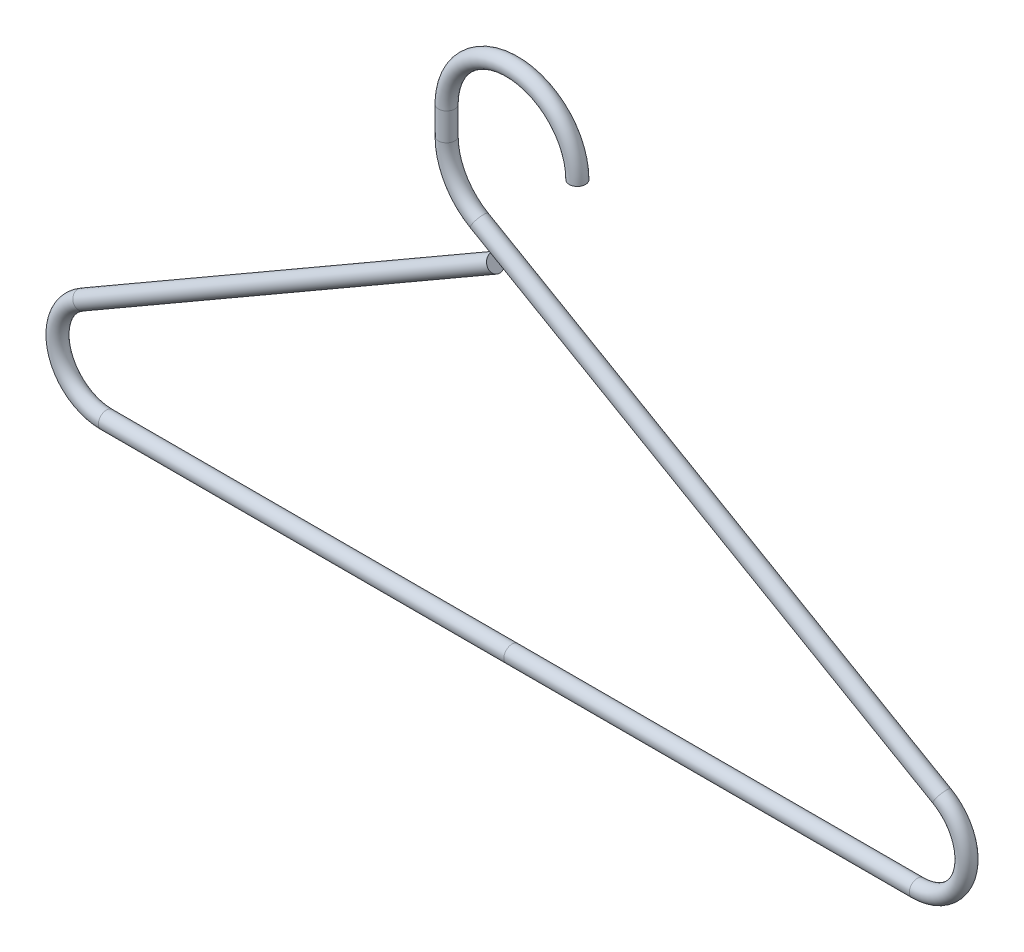
ISO-10303-21;
HEADER;
FILE_DESCRIPTION(('STEP AP214'),'2;1');
FILE_NAME('part.step','',(''),(''),'','','');
FILE_SCHEMA(('AUTOMOTIVE_DESIGN { 1 0 10303 214 1 1 1 1 }'));
ENDSEC;
DATA;
#1=APPLICATION_CONTEXT('core data for automotive mechanical design processes');
#2=APPLICATION_PROTOCOL_DEFINITION('international standard','automotive_design',2000,#1);
#3=PRODUCT_CONTEXT('',#1,'mechanical');
#4=PRODUCT('Part','Part','',(#3));
#5=PRODUCT_RELATED_PRODUCT_CATEGORY('part','',(#4));
#6=PRODUCT_DEFINITION_FORMATION('','',#4);
#7=PRODUCT_DEFINITION_CONTEXT('part definition',#1,'design');
#8=PRODUCT_DEFINITION('design','',#6,#7);
#9=PRODUCT_DEFINITION_SHAPE('','',#8);
#10=(LENGTH_UNIT() NAMED_UNIT(*) SI_UNIT(.MILLI.,.METRE.));
#11=(NAMED_UNIT(*) PLANE_ANGLE_UNIT() SI_UNIT($,.RADIAN.));
#12=(NAMED_UNIT(*) SI_UNIT($,.STERADIAN.) SOLID_ANGLE_UNIT());
#13=UNCERTAINTY_MEASURE_WITH_UNIT(LENGTH_MEASURE(1.E-05),#10,'distance_accuracy_value','');
#14=(GEOMETRIC_REPRESENTATION_CONTEXT(3) GLOBAL_UNCERTAINTY_ASSIGNED_CONTEXT((#13)) GLOBAL_UNIT_ASSIGNED_CONTEXT((#10,
#11,#12)) REPRESENTATION_CONTEXT('',''));
#15=CARTESIAN_POINT('',(0.,0.,0.));
#16=DIRECTION('',(0.,0.,1.));
#17=DIRECTION('',(1.,0.,0.));
#18=AXIS2_PLACEMENT_3D('',#15,#16,#17);
#19=CARTESIAN_POINT('',(25.4000000000011,172.046968374161,0.));
#20=DIRECTION('',(0.,-1.,0.));
#21=DIRECTION('',(1.,0.,0.));
#22=AXIS2_PLACEMENT_3D('',#19,#20,#21);
#23=PLANE('',#22);
#24=CARTESIAN_POINT('',(25.4000000000011,172.046968374161,0.));
#25=DIRECTION('',(0.,-1.,0.));
#26=DIRECTION('',(1.,0.,0.));
#27=AXIS2_PLACEMENT_3D('',#24,#25,#26);
#28=CIRCLE('',#27,3.175);
#29=CARTESIAN_POINT('',(28.5750000000011,172.046968374161,0.));
#30=VERTEX_POINT('',#29);
#31=EDGE_CURVE('E57',#30,#30,#28,.T.);
#32=ORIENTED_EDGE('',*,*,#31,.T.);
#33=EDGE_LOOP('',(#32));
#34=FACE_BOUND('',#33,.T.);
#35=ADVANCED_FACE('F45',(#34),#23,.T.);
#36=CARTESIAN_POINT('',(-6.35000000000019,128.316097327393,0.));
#37=DIRECTION('',(-0.866025403784441,-0.499999999999995,0.));
#38=DIRECTION('',(0.499999999999995,-0.866025403784442,0.));
#39=AXIS2_PLACEMENT_3D('',#36,#37,#38);
#40=PLANE('',#39);
#41=CARTESIAN_POINT('',(-6.35000000000019,128.316097327393,0.));
#42=DIRECTION('',(-0.866025403784441,-0.499999999999995,0.));
#43=DIRECTION('',(0.499999999999995,-0.866025403784442,0.));
#44=AXIS2_PLACEMENT_3D('',#41,#42,#43);
#45=CIRCLE('',#44,3.175);
#46=CARTESIAN_POINT('',(-4.7625000000002,125.566466670377,0.));
#47=VERTEX_POINT('',#46);
#48=EDGE_CURVE('E12',#47,#47,#45,.T.);
#49=ORIENTED_EDGE('',*,*,#48,.F.);
#50=EDGE_LOOP('',(#49));
#51=FACE_BOUND('',#50,.T.);
#52=ADVANCED_FACE('F63',(#51),#40,.F.);
#53=CARTESIAN_POINT('',(1.0998146837693E-12,172.046968374161,0.));
#54=DIRECTION('',(0.,0.,1.));
#55=DIRECTION('',(1.,0.,0.));
#56=AXIS2_PLACEMENT_3D('',#53,#54,#55);
#57=TOROIDAL_SURFACE('',#56,25.4,3.175);
#58=CARTESIAN_POINT('',(-25.3999999999989,172.046968374162,0.));
#59=DIRECTION('',(0.,1.,0.));
#60=DIRECTION('',(-1.,0.,0.));
#61=AXIS2_PLACEMENT_3D('',#58,#59,#60);
#62=CIRCLE('',#61,3.175);
#63=CARTESIAN_POINT('',(-28.5749999999989,172.046968374162,0.));
#64=VERTEX_POINT('',#63);
#65=EDGE_CURVE('E113',#64,#64,#62,.T.);
#66=ORIENTED_EDGE('',*,*,#65,.T.);
#67=EDGE_LOOP('',(#66));
#68=FACE_BOUND('',#67,.T.);
#69=ORIENTED_EDGE('',*,*,#31,.F.);
#70=EDGE_LOOP('',(#69));
#71=FACE_BOUND('',#70,.T.);
#72=ADVANCED_FACE('F65',(#68,#71),#57,.T.);
#73=CARTESIAN_POINT('',(-25.3999999999989,172.046968374162,0.));
#74=DIRECTION('',(0.,-1.,0.));
#75=DIRECTION('',(0.,0.,-1.));
#76=AXIS2_PLACEMENT_3D('',#73,#74,#75);
#77=CYLINDRICAL_SURFACE('',#76,3.175);
#78=CARTESIAN_POINT('',(-25.3999999999989,161.311665211579,0.));
#79=DIRECTION('',(0.,1.,0.));
#80=DIRECTION('',(-1.,0.,0.));
#81=AXIS2_PLACEMENT_3D('',#78,#79,#80);
#82=CIRCLE('',#81,3.175);
#83=CARTESIAN_POINT('',(-28.5749999999987,161.311665211579,0.));
#84=VERTEX_POINT('',#83);
#85=EDGE_CURVE('E110',#84,#84,#82,.T.);
#86=ORIENTED_EDGE('',*,*,#85,.T.);
#87=EDGE_LOOP('',(#86));
#88=FACE_BOUND('',#87,.T.);
#89=ORIENTED_EDGE('',*,*,#65,.F.);
#90=EDGE_LOOP('',(#89));
#91=FACE_BOUND('',#90,.T.);
#92=ADVANCED_FACE('F70',(#88,#91),#77,.T.);
#93=CARTESIAN_POINT('',(1.32185928869433E-12,161.311665211579,0.));
#94=DIRECTION('',(0.,0.,1.));
#95=DIRECTION('',(1.,0.,0.));
#96=AXIS2_PLACEMENT_3D('',#93,#94,#95);
#97=TOROIDAL_SURFACE('',#96,25.4000000000001,3.175);
#98=CARTESIAN_POINT('',(-12.6999999999988,139.314619955454,0.));
#99=DIRECTION('',(-0.866025403784436,0.500000000000004,0.));
#100=DIRECTION('',(-0.500000000000004,-0.866025403784436,0.));
#101=AXIS2_PLACEMENT_3D('',#98,#99,#100);
#102=CIRCLE('',#101,3.175);
#103=CARTESIAN_POINT('',(-14.2874999999988,136.564989298438,0.));
#104=VERTEX_POINT('',#103);
#105=EDGE_CURVE('E115',#104,#104,#102,.T.);
#106=CARTESIAN_POINT('',(1.32185928869433E-12,161.311665211579,0.));
#107=DIRECTION('',(0.,0.,1.));
#108=DIRECTION('',(1.,0.,0.));
#109=AXIS2_PLACEMENT_3D('',#106,#107,#108);
#110=CIRCLE('',#109,28.5750000000001);
#111=EDGE_CURVE('',#84,#104,#110,.T.);
#112=ORIENTED_EDGE('',*,*,#85,.F.);
#113=ORIENTED_EDGE('',*,*,#105,.T.);
#114=ORIENTED_EDGE('',*,*,#111,.T.);
#115=ORIENTED_EDGE('',*,*,#111,.F.);
#116=EDGE_LOOP('',(#112,#114,#113,#115));
#117=FACE_BOUND('',#116,.T.);
#118=ADVANCED_FACE('F98',(#117),#97,.T.);
#119=CARTESIAN_POINT('',(-12.6999999999988,139.314619955454,0.));
#120=DIRECTION('',(0.866025403784442,-0.499999999999995,0.));
#121=DIRECTION('',(0.499999999999995,0.866025403784442,0.));
#122=AXIS2_PLACEMENT_3D('',#119,#120,#121);
#123=CYLINDRICAL_SURFACE('',#122,3.175);
#124=CARTESIAN_POINT('',(167.029432115812,35.5477839420936,0.));
#125=DIRECTION('',(-0.866025403784442,0.499999999999995,0.));
#126=DIRECTION('',(-0.499999999999995,-0.866025403784442,0.));
#127=AXIS2_PLACEMENT_3D('',#124,#125,#126);
#128=CIRCLE('',#127,3.175);
#129=CARTESIAN_POINT('',(168.616932115812,38.2974145991092,0.));
#130=VERTEX_POINT('',#129);
#131=EDGE_CURVE('E121',#130,#130,#128,.T.);
#132=ORIENTED_EDGE('',*,*,#131,.T.);
#133=EDGE_LOOP('',(#132));
#134=FACE_BOUND('',#133,.T.);
#135=ORIENTED_EDGE('',*,*,#105,.F.);
#136=EDGE_LOOP('',(#135));
#137=FACE_BOUND('',#136,.T.);
#138=ADVANCED_FACE('F94',(#134,#137),#123,.T.);
#139=CARTESIAN_POINT('',(157.504432115812,19.05,0.));
#140=DIRECTION('',(0.,0.,-1.));
#141=DIRECTION('',(-1.,0.,0.));
#142=AXIS2_PLACEMENT_3D('',#139,#140,#141);
#143=TOROIDAL_SURFACE('',#142,19.05,3.175);
#144=CARTESIAN_POINT('',(157.504432115812,0.,0.));
#145=DIRECTION('',(1.,0.,0.));
#146=DIRECTION('',(0.,1.,0.));
#147=AXIS2_PLACEMENT_3D('',#144,#145,#146);
#148=CIRCLE('',#147,3.175);
#149=CARTESIAN_POINT('',(157.504432115812,-3.175,0.));
#150=VERTEX_POINT('',#149);
#151=EDGE_CURVE('E124',#150,#150,#148,.T.);
#152=CARTESIAN_POINT('',(157.504432115812,19.05,0.));
#153=DIRECTION('',(0.,0.,-1.));
#154=DIRECTION('',(-1.,0.,0.));
#155=AXIS2_PLACEMENT_3D('',#152,#153,#154);
#156=CIRCLE('',#155,22.225);
#157=EDGE_CURVE('',#130,#150,#156,.T.);
#158=ORIENTED_EDGE('',*,*,#131,.F.);
#159=ORIENTED_EDGE('',*,*,#151,.T.);
#160=ORIENTED_EDGE('',*,*,#157,.T.);
#161=ORIENTED_EDGE('',*,*,#157,.F.);
#162=EDGE_LOOP('',(#158,#160,#159,#161));
#163=FACE_BOUND('',#162,.T.);
#164=ADVANCED_FACE('F90',(#163),#143,.T.);
#165=CARTESIAN_POINT('',(157.504432115812,0.,0.));
#166=DIRECTION('',(-1.,0.,0.));
#167=DIRECTION('',(0.,0.,1.));
#168=AXIS2_PLACEMENT_3D('',#165,#166,#167);
#169=CYLINDRICAL_SURFACE('',#168,3.175);
#170=CARTESIAN_POINT('',(0.,0.,0.));
#171=DIRECTION('',(1.,0.,0.));
#172=DIRECTION('',(0.,1.,0.));
#173=AXIS2_PLACEMENT_3D('',#170,#171,#172);
#174=CIRCLE('',#173,3.175);
#175=CARTESIAN_POINT('',(0.,3.17499999999999,0.));
#176=VERTEX_POINT('',#175);
#177=EDGE_CURVE('E127',#176,#176,#174,.T.);
#178=ORIENTED_EDGE('',*,*,#177,.T.);
#179=EDGE_LOOP('',(#178));
#180=FACE_BOUND('',#179,.T.);
#181=ORIENTED_EDGE('',*,*,#151,.F.);
#182=EDGE_LOOP('',(#181));
#183=FACE_BOUND('',#182,.T.);
#184=ADVANCED_FACE('F86',(#180,#183),#169,.T.);
#185=CARTESIAN_POINT('',(0.,0.,0.));
#186=DIRECTION('',(-1.,0.,0.));
#187=DIRECTION('',(0.,-1.,0.));
#188=AXIS2_PLACEMENT_3D('',#185,#186,#187);
#189=CYLINDRICAL_SURFACE('',#188,3.175);
#190=CARTESIAN_POINT('',(-157.504432115812,0.,0.));
#191=DIRECTION('',(1.,0.,0.));
#192=DIRECTION('',(0.,1.,0.));
#193=AXIS2_PLACEMENT_3D('',#190,#191,#192);
#194=CIRCLE('',#193,3.175);
#195=CARTESIAN_POINT('',(-157.504432115812,-3.17500000000004,0.));
#196=VERTEX_POINT('',#195);
#197=EDGE_CURVE('E130',#196,#196,#194,.T.);
#198=ORIENTED_EDGE('',*,*,#197,.T.);
#199=EDGE_LOOP('',(#198));
#200=FACE_BOUND('',#199,.T.);
#201=ORIENTED_EDGE('',*,*,#177,.F.);
#202=EDGE_LOOP('',(#201));
#203=FACE_BOUND('',#202,.T.);
#204=ADVANCED_FACE('F80',(#200,#203),#189,.T.);
#205=CARTESIAN_POINT('',(-157.504432115812,19.05,0.));
#206=DIRECTION('',(0.,0.,-1.));
#207=DIRECTION('',(-1.,0.,0.));
#208=AXIS2_PLACEMENT_3D('',#205,#206,#207);
#209=TOROIDAL_SURFACE('',#208,19.05,3.175);
#210=CARTESIAN_POINT('',(-167.029432115812,35.5477839420936,0.));
#211=DIRECTION('',(-0.866025403784441,-0.499999999999995,0.));
#212=DIRECTION('',(0.499999999999995,-0.866025403784442,0.));
#213=AXIS2_PLACEMENT_3D('',#210,#211,#212);
#214=CIRCLE('',#213,3.175);
#215=CARTESIAN_POINT('',(-168.616932115812,38.2974145991092,0.));
#216=VERTEX_POINT('',#215);
#217=EDGE_CURVE('E52',#216,#216,#214,.T.);
#218=CARTESIAN_POINT('',(-157.504432115812,19.05,0.));
#219=DIRECTION('',(0.,0.,-1.));
#220=DIRECTION('',(-1.,0.,0.));
#221=AXIS2_PLACEMENT_3D('',#218,#219,#220);
#222=CIRCLE('',#221,22.225);
#223=EDGE_CURVE('',#196,#216,#222,.T.);
#224=ORIENTED_EDGE('',*,*,#197,.F.);
#225=ORIENTED_EDGE('',*,*,#217,.T.);
#226=ORIENTED_EDGE('',*,*,#223,.T.);
#227=ORIENTED_EDGE('',*,*,#223,.F.);
#228=EDGE_LOOP('',(#224,#226,#225,#227));
#229=FACE_BOUND('',#228,.T.);
#230=ADVANCED_FACE('F76',(#229),#209,.T.);
#231=CARTESIAN_POINT('',(-167.029432115812,35.5477839420936,0.));
#232=DIRECTION('',(0.866025403784441,0.499999999999995,0.));
#233=DIRECTION('',(-0.499999999999995,0.866025403784441,0.));
#234=AXIS2_PLACEMENT_3D('',#231,#232,#233);
#235=CYLINDRICAL_SURFACE('',#234,3.175);
#236=ORIENTED_EDGE('',*,*,#48,.T.);
#237=EDGE_LOOP('',(#236));
#238=FACE_BOUND('',#237,.T.);
#239=ORIENTED_EDGE('',*,*,#217,.F.);
#240=EDGE_LOOP('',(#239));
#241=FACE_BOUND('',#240,.T.);
#242=ADVANCED_FACE('F60',(#238,#241),#235,.T.);
#243=CLOSED_SHELL('',(#35,#52,#72,#92,#118,#138,#164,#184,#204,#230,#242));
#244=MANIFOLD_SOLID_BREP('B2',#243);
#245=ADVANCED_BREP_SHAPE_REPRESENTATION('',(#18,#244),#14);
#246=SHAPE_DEFINITION_REPRESENTATION(#9,#245);
ENDSEC;
END-ISO-10303-21;
